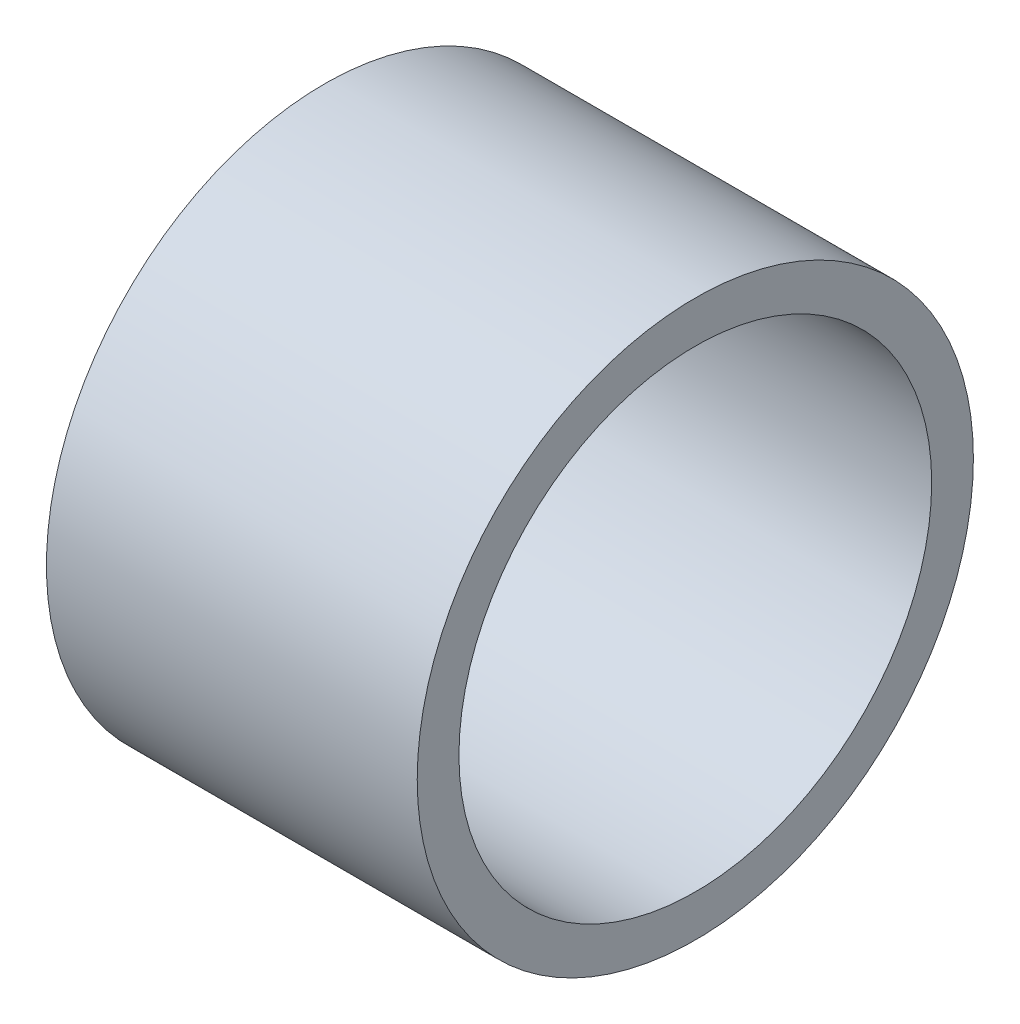
ISO-10303-21;
HEADER;
FILE_DESCRIPTION(('STEP AP214'),'2;1');
FILE_NAME('part.step','',(''),(''),'','','');
FILE_SCHEMA(('AUTOMOTIVE_DESIGN { 1 0 10303 214 1 1 1 1 }'));
ENDSEC;
DATA;
#1=APPLICATION_CONTEXT('core data for automotive mechanical design processes');
#2=APPLICATION_PROTOCOL_DEFINITION('international standard','automotive_design',2000,#1);
#3=PRODUCT_CONTEXT('',#1,'mechanical');
#4=PRODUCT('Part','Part','',(#3));
#5=PRODUCT_RELATED_PRODUCT_CATEGORY('part','',(#4));
#6=PRODUCT_DEFINITION_FORMATION('','',#4);
#7=PRODUCT_DEFINITION_CONTEXT('part definition',#1,'design');
#8=PRODUCT_DEFINITION('design','',#6,#7);
#9=PRODUCT_DEFINITION_SHAPE('','',#8);
#10=(LENGTH_UNIT() NAMED_UNIT(*) SI_UNIT(.MILLI.,.METRE.));
#11=(NAMED_UNIT(*) PLANE_ANGLE_UNIT() SI_UNIT($,.RADIAN.));
#12=(NAMED_UNIT(*) SI_UNIT($,.STERADIAN.) SOLID_ANGLE_UNIT());
#13=UNCERTAINTY_MEASURE_WITH_UNIT(LENGTH_MEASURE(1.E-05),#10,'distance_accuracy_value','');
#14=(GEOMETRIC_REPRESENTATION_CONTEXT(3) GLOBAL_UNCERTAINTY_ASSIGNED_CONTEXT((#13)) GLOBAL_UNIT_ASSIGNED_CONTEXT((#10,
#11,#12)) REPRESENTATION_CONTEXT('',''));
#15=CARTESIAN_POINT('',(0.,0.,0.));
#16=DIRECTION('',(0.,0.,1.));
#17=DIRECTION('',(1.,0.,0.));
#18=AXIS2_PLACEMENT_3D('',#15,#16,#17);
#19=CARTESIAN_POINT('',(4.,0.,0.));
#20=DIRECTION('',(1.,0.,0.));
#21=DIRECTION('',(0.,0.,-1.));
#22=AXIS2_PLACEMENT_3D('',#19,#20,#21);
#23=PLANE('',#22);
#24=CARTESIAN_POINT('',(4.,0.,0.));
#25=DIRECTION('',(1.,0.,0.));
#26=DIRECTION('',(0.,0.,-1.));
#27=AXIS2_PLACEMENT_3D('',#24,#25,#26);
#28=CIRCLE('',#27,5.1);
#29=CARTESIAN_POINT('',(4.,0.,-5.1));
#30=VERTEX_POINT('',#29);
#31=EDGE_CURVE('E30',#30,#30,#28,.T.);
#32=ORIENTED_EDGE('',*,*,#31,.F.);
#33=EDGE_LOOP('',(#32));
#34=FACE_BOUND('',#33,.T.);
#35=CARTESIAN_POINT('',(4.,0.,0.));
#36=DIRECTION('',(-1.,0.,0.));
#37=DIRECTION('',(0.,0.,1.));
#38=AXIS2_PLACEMENT_3D('',#35,#36,#37);
#39=CIRCLE('',#38,6.);
#40=CARTESIAN_POINT('',(4.,0.,6.));
#41=VERTEX_POINT('',#40);
#42=EDGE_CURVE('E10',#41,#41,#39,.T.);
#43=ORIENTED_EDGE('',*,*,#42,.F.);
#44=EDGE_LOOP('',(#43));
#45=FACE_BOUND('',#44,.T.);
#46=ADVANCED_FACE('F15',(#34,#45),#23,.T.);
#47=CARTESIAN_POINT('',(-4.,0.,0.));
#48=DIRECTION('',(-1.,0.,0.));
#49=DIRECTION('',(0.,0.,1.));
#50=AXIS2_PLACEMENT_3D('',#47,#48,#49);
#51=PLANE('',#50);
#52=CARTESIAN_POINT('',(-4.,0.,0.));
#53=DIRECTION('',(-1.,0.,0.));
#54=DIRECTION('',(0.,0.,1.));
#55=AXIS2_PLACEMENT_3D('',#52,#53,#54);
#56=CIRCLE('',#55,5.1);
#57=CARTESIAN_POINT('',(-4.,0.,5.1));
#58=VERTEX_POINT('',#57);
#59=EDGE_CURVE('E19',#58,#58,#56,.T.);
#60=ORIENTED_EDGE('',*,*,#59,.F.);
#61=EDGE_LOOP('',(#60));
#62=FACE_BOUND('',#61,.T.);
#63=CARTESIAN_POINT('',(-4.,0.,0.));
#64=DIRECTION('',(1.,0.,0.));
#65=DIRECTION('',(0.,0.,-1.));
#66=AXIS2_PLACEMENT_3D('',#63,#64,#65);
#67=CIRCLE('',#66,6.);
#68=CARTESIAN_POINT('',(-4.,0.,-6.));
#69=VERTEX_POINT('',#68);
#70=EDGE_CURVE('E24',#69,#69,#67,.T.);
#71=ORIENTED_EDGE('',*,*,#70,.F.);
#72=EDGE_LOOP('',(#71));
#73=FACE_BOUND('',#72,.T.);
#74=ADVANCED_FACE('F43',(#62,#73),#51,.T.);
#75=CARTESIAN_POINT('',(-4.,0.,0.));
#76=DIRECTION('',(1.,0.,0.));
#77=DIRECTION('',(0.,0.,-1.));
#78=AXIS2_PLACEMENT_3D('',#75,#76,#77);
#79=CYLINDRICAL_SURFACE('',#78,6.);
#80=ORIENTED_EDGE('',*,*,#42,.T.);
#81=EDGE_LOOP('',(#80));
#82=FACE_BOUND('',#81,.T.);
#83=ORIENTED_EDGE('',*,*,#70,.T.);
#84=EDGE_LOOP('',(#83));
#85=FACE_BOUND('',#84,.T.);
#86=ADVANCED_FACE('F17',(#82,#85),#79,.T.);
#87=CARTESIAN_POINT('',(-4.3,0.,0.));
#88=DIRECTION('',(1.,0.,0.));
#89=DIRECTION('',(0.,0.,-1.));
#90=AXIS2_PLACEMENT_3D('',#87,#88,#89);
#91=CYLINDRICAL_SURFACE('',#90,5.1);
#92=ORIENTED_EDGE('',*,*,#31,.T.);
#93=EDGE_LOOP('',(#92));
#94=FACE_BOUND('',#93,.T.);
#95=ORIENTED_EDGE('',*,*,#59,.T.);
#96=EDGE_LOOP('',(#95));
#97=FACE_BOUND('',#96,.T.);
#98=ADVANCED_FACE('F41',(#94,#97),#91,.F.);
#99=CLOSED_SHELL('',(#46,#74,#86,#98));
#100=MANIFOLD_SOLID_BREP('B1',#99);
#101=ADVANCED_BREP_SHAPE_REPRESENTATION('',(#18,#100),#14);
#102=SHAPE_DEFINITION_REPRESENTATION(#9,#101);
ENDSEC;
END-ISO-10303-21;
